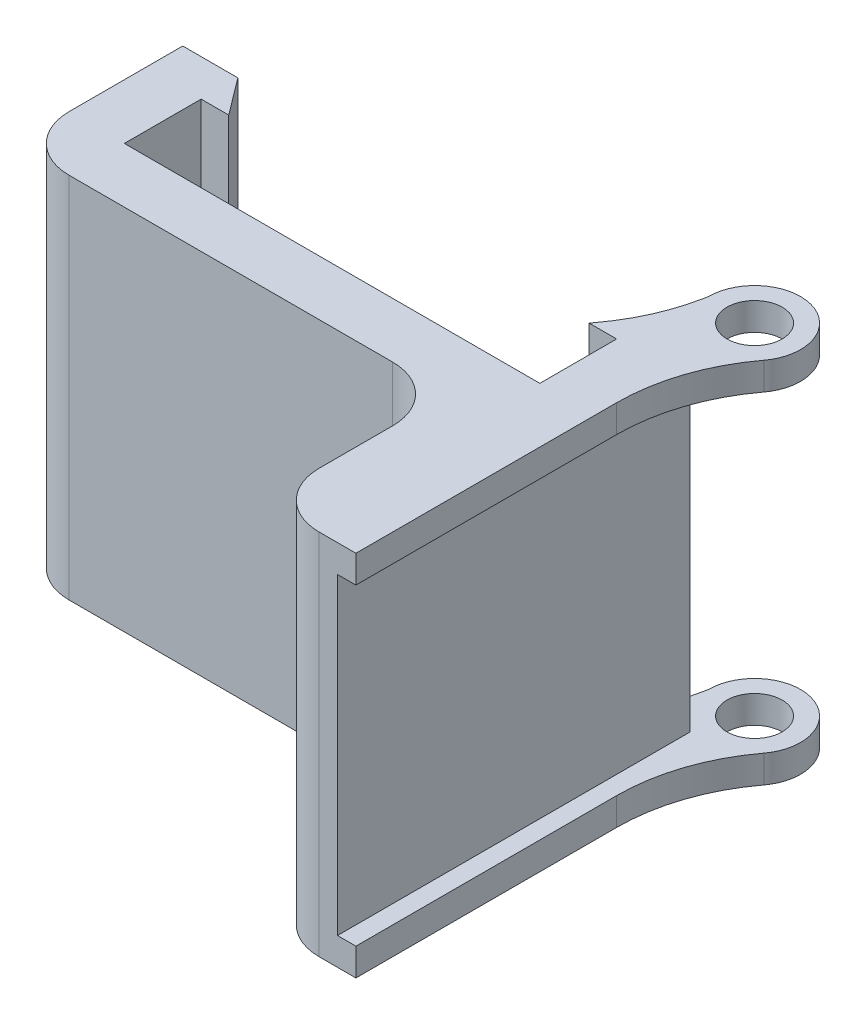
ISO-10303-21;
HEADER;
FILE_DESCRIPTION(('STEP AP214'),'2;1');
FILE_NAME('part.step','',(''),(''),'','','');
FILE_SCHEMA(('AUTOMOTIVE_DESIGN { 1 0 10303 214 1 1 1 1 }'));
ENDSEC;
DATA;
#1=APPLICATION_CONTEXT('core data for automotive mechanical design processes');
#2=APPLICATION_PROTOCOL_DEFINITION('international standard','automotive_design',2000,#1);
#3=PRODUCT_CONTEXT('',#1,'mechanical');
#4=PRODUCT('Part','Part','',(#3));
#5=PRODUCT_RELATED_PRODUCT_CATEGORY('part','',(#4));
#6=PRODUCT_DEFINITION_FORMATION('','',#4);
#7=PRODUCT_DEFINITION_CONTEXT('part definition',#1,'design');
#8=PRODUCT_DEFINITION('design','',#6,#7);
#9=PRODUCT_DEFINITION_SHAPE('','',#8);
#10=(LENGTH_UNIT() NAMED_UNIT(*) SI_UNIT(.MILLI.,.METRE.));
#11=(NAMED_UNIT(*) PLANE_ANGLE_UNIT() SI_UNIT($,.RADIAN.));
#12=(NAMED_UNIT(*) SI_UNIT($,.STERADIAN.) SOLID_ANGLE_UNIT());
#13=UNCERTAINTY_MEASURE_WITH_UNIT(LENGTH_MEASURE(1.E-05),#10,'distance_accuracy_value','');
#14=(GEOMETRIC_REPRESENTATION_CONTEXT(3) GLOBAL_UNCERTAINTY_ASSIGNED_CONTEXT((#13)) GLOBAL_UNIT_ASSIGNED_CONTEXT((#10,
#11,#12)) REPRESENTATION_CONTEXT('',''));
#15=CARTESIAN_POINT('',(0.,0.,0.));
#16=DIRECTION('',(0.,0.,1.));
#17=DIRECTION('',(1.,0.,0.));
#18=AXIS2_PLACEMENT_3D('',#15,#16,#17);
#19=CARTESIAN_POINT('',(0.,0.,18.));
#20=DIRECTION('',(0.,0.,-1.));
#21=DIRECTION('',(0.,1.,0.));
#22=AXIS2_PLACEMENT_3D('',#19,#20,#21);
#23=PLANE('',#22);
#24=DIRECTION('',(1.,0.,0.));
#25=VECTOR('',#24,1.);
#26=CARTESIAN_POINT('',(11.295,74.1919670440661,18.));
#27=LINE('',#26,#25);
#28=CARTESIAN_POINT('',(11.295,74.1919670440661,18.));
#29=VERTEX_POINT('',#28);
#30=CARTESIAN_POINT('',(13.295,74.1919670440661,18.));
#31=VERTEX_POINT('',#30);
#32=EDGE_CURVE('E290',#29,#31,#27,.T.);
#33=ORIENTED_EDGE('',*,*,#32,.T.);
#34=DIRECTION('',(0.,1.,0.));
#35=VECTOR('',#34,1.);
#36=CARTESIAN_POINT('',(13.295,74.1919670440661,18.));
#37=LINE('',#36,#35);
#38=CARTESIAN_POINT('',(13.295,57.1919670440661,18.));
#39=VERTEX_POINT('',#38);
#40=EDGE_CURVE('E257',#39,#31,#37,.T.);
#41=ORIENTED_EDGE('',*,*,#40,.F.);
#42=DIRECTION('',(-1.,0.,0.));
#43=VECTOR('',#42,1.);
#44=CARTESIAN_POINT('',(11.295,57.1919670440661,18.));
#45=LINE('',#44,#43);
#46=CARTESIAN_POINT('',(11.295,57.1919670440661,18.));
#47=VERTEX_POINT('',#46);
#48=EDGE_CURVE('E253',#39,#47,#45,.T.);
#49=ORIENTED_EDGE('',*,*,#48,.T.);
#50=DIRECTION('',(0.,1.,0.));
#51=VECTOR('',#50,1.);
#52=CARTESIAN_POINT('',(11.295,75.6919670440661,18.));
#53=LINE('',#52,#51);
#54=EDGE_CURVE('E385',#47,#29,#53,.T.);
#55=ORIENTED_EDGE('',*,*,#54,.T.);
#56=EDGE_LOOP('',(#33,#41,#49,#55));
#57=FACE_BOUND('',#56,.T.);
#58=ADVANCED_FACE('F54',(#57),#23,.T.);
#59=CARTESIAN_POINT('',(14.295,55.6919670440661,27.175));
#60=DIRECTION('',(-1.,0.,0.));
#61=DIRECTION('',(0.,0.,1.));
#62=AXIS2_PLACEMENT_3D('',#59,#60,#61);
#63=PLANE('',#62);
#64=DIRECTION('',(0.,0.,1.));
#65=VECTOR('',#64,1.);
#66=CARTESIAN_POINT('',(14.295,74.1919670440661,37.175));
#67=LINE('',#66,#65);
#68=CARTESIAN_POINT('',(14.295,74.1919670440661,23.));
#69=VERTEX_POINT('',#68);
#70=CARTESIAN_POINT('',(14.295,74.1919670440661,37.175));
#71=VERTEX_POINT('',#70);
#72=EDGE_CURVE('E266',#69,#71,#67,.T.);
#73=ORIENTED_EDGE('',*,*,#72,.F.);
#74=DIRECTION('',(0.,1.,0.));
#75=VECTOR('',#74,1.);
#76=CARTESIAN_POINT('',(14.295,55.6919670440661,23.));
#77=LINE('',#76,#75);
#78=CARTESIAN_POINT('',(14.295,75.6919670440661,23.));
#79=VERTEX_POINT('',#78);
#80=EDGE_CURVE('E420',#69,#79,#77,.T.);
#81=ORIENTED_EDGE('',*,*,#80,.T.);
#82=DIRECTION('',(0.,0.,-1.));
#83=VECTOR('',#82,1.);
#84=CARTESIAN_POINT('',(14.295,75.6919670440661,27.175));
#85=LINE('',#84,#83);
#86=CARTESIAN_POINT('',(14.295,75.6919670440661,37.175));
#87=VERTEX_POINT('',#86);
#88=EDGE_CURVE('E402',#87,#79,#85,.T.);
#89=ORIENTED_EDGE('',*,*,#88,.F.);
#90=DIRECTION('',(0.,1.,0.));
#91=VECTOR('',#90,1.);
#92=CARTESIAN_POINT('',(14.295,75.6919670440661,37.175));
#93=LINE('',#92,#91);
#94=EDGE_CURVE('E319',#71,#87,#93,.T.);
#95=ORIENTED_EDGE('',*,*,#94,.F.);
#96=EDGE_LOOP('',(#73,#81,#89,#95));
#97=FACE_BOUND('',#96,.T.);
#98=ADVANCED_FACE('F499',(#97),#63,.F.);
#99=CARTESIAN_POINT('',(0.,0.,27.175));
#100=DIRECTION('',(0.,0.,-1.));
#101=DIRECTION('',(-1.,0.,0.));
#102=AXIS2_PLACEMENT_3D('',#99,#100,#101);
#103=PLANE('',#102);
#104=DIRECTION('',(1.,0.,0.));
#105=VECTOR('',#104,1.);
#106=CARTESIAN_POINT('',(-14.295,55.6919670440661,27.175));
#107=LINE('',#106,#105);
#108=CARTESIAN_POINT('',(-11.295,55.6919670440661,27.175));
#109=VERTEX_POINT('',#108);
#110=CARTESIAN_POINT('',(6.295,55.6919670440661,27.175));
#111=VERTEX_POINT('',#110);
#112=EDGE_CURVE('E391',#109,#111,#107,.T.);
#113=ORIENTED_EDGE('',*,*,#112,.T.);
#114=DIRECTION('',(0.,-1.,0.));
#115=VECTOR('',#114,1.);
#116=CARTESIAN_POINT('',(6.295,75.6919670440661,27.175));
#117=LINE('',#116,#115);
#118=CARTESIAN_POINT('',(6.295,75.6919670440661,27.175));
#119=VERTEX_POINT('',#118);
#120=EDGE_CURVE('E76',#111,#119,#117,.F.);
#121=ORIENTED_EDGE('',*,*,#120,.T.);
#122=DIRECTION('',(-1.,0.,0.));
#123=VECTOR('',#122,1.);
#124=CARTESIAN_POINT('',(-14.295,75.6919670440661,27.175));
#125=LINE('',#124,#123);
#126=CARTESIAN_POINT('',(-11.295,75.6919670440661,27.175));
#127=VERTEX_POINT('',#126);
#128=EDGE_CURVE('E393',#119,#127,#125,.T.);
#129=ORIENTED_EDGE('',*,*,#128,.T.);
#130=DIRECTION('',(0.,-1.,0.));
#131=VECTOR('',#130,1.);
#132=CARTESIAN_POINT('',(-11.295,0.,27.175));
#133=LINE('',#132,#131);
#134=EDGE_CURVE('E469',#127,#109,#133,.T.);
#135=ORIENTED_EDGE('',*,*,#134,.T.);
#136=EDGE_LOOP('',(#113,#121,#129,#135));
#137=FACE_BOUND('',#136,.T.);
#138=ADVANCED_FACE('F481',(#137),#103,.F.);
#139=CARTESIAN_POINT('',(0.,0.,24.175));
#140=DIRECTION('',(0.,0.,-1.));
#141=DIRECTION('',(-1.,0.,0.));
#142=AXIS2_PLACEMENT_3D('',#139,#140,#141);
#143=PLANE('',#142);
#144=DIRECTION('',(1.,0.,0.));
#145=VECTOR('',#144,1.);
#146=CARTESIAN_POINT('',(-14.295,55.6919670440661,24.175));
#147=LINE('',#146,#145);
#148=CARTESIAN_POINT('',(-11.295,55.6919670440661,24.175));
#149=VERTEX_POINT('',#148);
#150=CARTESIAN_POINT('',(11.295,55.6919670440661,24.175));
#151=VERTEX_POINT('',#150);
#152=EDGE_CURVE('E388',#149,#151,#147,.T.);
#153=ORIENTED_EDGE('',*,*,#152,.F.);
#154=DIRECTION('',(0.,-1.,0.));
#155=VECTOR('',#154,1.);
#156=CARTESIAN_POINT('',(-11.295,75.6919670440661,24.175));
#157=LINE('',#156,#155);
#158=CARTESIAN_POINT('',(-11.295,75.6919670440661,24.175));
#159=VERTEX_POINT('',#158);
#160=EDGE_CURVE('E364',#159,#149,#157,.T.);
#161=ORIENTED_EDGE('',*,*,#160,.F.);
#162=DIRECTION('',(-1.,0.,0.));
#163=VECTOR('',#162,1.);
#164=CARTESIAN_POINT('',(-14.295,75.6919670440661,24.175));
#165=LINE('',#164,#163);
#166=CARTESIAN_POINT('',(11.295,75.6919670440661,24.175));
#167=VERTEX_POINT('',#166);
#168=EDGE_CURVE('E394',#167,#159,#165,.T.);
#169=ORIENTED_EDGE('',*,*,#168,.F.);
#170=DIRECTION('',(0.,1.,0.));
#171=VECTOR('',#170,1.);
#172=CARTESIAN_POINT('',(11.295,75.6919670440661,24.175));
#173=LINE('',#172,#171);
#174=EDGE_CURVE('E381',#151,#167,#173,.T.);
#175=ORIENTED_EDGE('',*,*,#174,.F.);
#176=EDGE_LOOP('',(#153,#161,#169,#175));
#177=FACE_BOUND('',#176,.T.);
#178=ADVANCED_FACE('F540',(#177),#143,.T.);
#179=CARTESIAN_POINT('',(-14.295,55.6919670440661,27.175));
#180=DIRECTION('',(1.,0.,0.));
#181=DIRECTION('',(0.,0.,-1.));
#182=AXIS2_PLACEMENT_3D('',#179,#180,#181);
#183=PLANE('',#182);
#184=DIRECTION('',(0.,0.,-1.));
#185=VECTOR('',#184,1.);
#186=CARTESIAN_POINT('',(-14.295,55.6919670440661,27.175));
#187=LINE('',#186,#185);
#188=CARTESIAN_POINT('',(-14.295,55.6919670440661,24.175));
#189=VERTEX_POINT('',#188);
#190=CARTESIAN_POINT('',(-14.295,55.6919670440661,18.));
#191=VERTEX_POINT('',#190);
#192=EDGE_CURVE('E408',#189,#191,#187,.T.);
#193=ORIENTED_EDGE('',*,*,#192,.F.);
#194=DIRECTION('',(0.,-1.,0.));
#195=VECTOR('',#194,1.);
#196=CARTESIAN_POINT('',(-14.295,55.6919670440661,24.175));
#197=LINE('',#196,#195);
#198=CARTESIAN_POINT('',(-14.295,75.6919670440661,24.175));
#199=VERTEX_POINT('',#198);
#200=EDGE_CURVE('E473',#189,#199,#197,.F.);
#201=ORIENTED_EDGE('',*,*,#200,.T.);
#202=DIRECTION('',(0.,0.,-1.));
#203=VECTOR('',#202,1.);
#204=CARTESIAN_POINT('',(-14.295,75.6919670440661,27.175));
#205=LINE('',#204,#203);
#206=CARTESIAN_POINT('',(-14.295,75.6919670440661,18.));
#207=VERTEX_POINT('',#206);
#208=EDGE_CURVE('E396',#199,#207,#205,.T.);
#209=ORIENTED_EDGE('',*,*,#208,.T.);
#210=DIRECTION('',(0.,1.,0.));
#211=VECTOR('',#210,1.);
#212=CARTESIAN_POINT('',(-14.295,75.6919670440661,18.));
#213=LINE('',#212,#211);
#214=EDGE_CURVE('E371',#191,#207,#213,.T.);
#215=ORIENTED_EDGE('',*,*,#214,.F.);
#216=EDGE_LOOP('',(#193,#201,#209,#215));
#217=FACE_BOUND('',#216,.T.);
#218=ADVANCED_FACE('F561',(#217),#183,.F.);
#219=CARTESIAN_POINT('',(-14.295,55.6919670440661,27.175));
#220=DIRECTION('',(0.,1.,0.));
#221=DIRECTION('',(0.,0.,1.));
#222=AXIS2_PLACEMENT_3D('',#219,#220,#221);
#223=PLANE('',#222);
#224=CARTESIAN_POINT('',(14.295,55.6919670440661,15.5));
#225=DIRECTION('',(0.,1.,0.));
#226=DIRECTION('',(0.,0.,1.));
#227=AXIS2_PLACEMENT_3D('',#224,#225,#226);
#228=CIRCLE('',#227,1.5);
#229=CARTESIAN_POINT('',(14.295,55.6919670440661,17.));
#230=VERTEX_POINT('',#229);
#231=EDGE_CURVE('E282',#230,#230,#228,.F.);
#232=ORIENTED_EDGE('',*,*,#231,.F.);
#233=EDGE_LOOP('',(#232));
#234=FACE_BOUND('',#233,.T.);
#235=DIRECTION('',(1.,0.,0.));
#236=VECTOR('',#235,1.);
#237=CARTESIAN_POINT('',(14.295,55.6919670440661,37.175));
#238=LINE('',#237,#236);
#239=CARTESIAN_POINT('',(12.295,55.6919670440661,37.175));
#240=VERTEX_POINT('',#239);
#241=CARTESIAN_POINT('',(14.295,55.6919670440661,37.175));
#242=VERTEX_POINT('',#241);
#243=EDGE_CURVE('E323',#240,#242,#238,.T.);
#244=ORIENTED_EDGE('',*,*,#243,.F.);
#245=CARTESIAN_POINT('',(12.295,55.6919670440661,34.175));
#246=DIRECTION('',(0.,1.,0.));
#247=DIRECTION('',(0.,0.,1.));
#248=AXIS2_PLACEMENT_3D('',#245,#246,#247);
#249=CIRCLE('',#248,3.);
#250=CARTESIAN_POINT('',(9.295,55.6919670440661,34.175));
#251=VERTEX_POINT('',#250);
#252=EDGE_CURVE('E459',#240,#251,#249,.F.);
#253=ORIENTED_EDGE('',*,*,#252,.T.);
#254=DIRECTION('',(0.,0.,-1.));
#255=VECTOR('',#254,1.);
#256=CARTESIAN_POINT('',(9.295,55.6919670440661,37.175));
#257=LINE('',#256,#255);
#258=CARTESIAN_POINT('',(9.295,55.6919670440661,30.175));
#259=VERTEX_POINT('',#258);
#260=EDGE_CURVE('E325',#251,#259,#257,.T.);
#261=ORIENTED_EDGE('',*,*,#260,.T.);
#262=CARTESIAN_POINT('',(6.295,55.6919670440661,30.175));
#263=DIRECTION('',(0.,1.,0.));
#264=DIRECTION('',(0.,0.,1.));
#265=AXIS2_PLACEMENT_3D('',#262,#263,#264);
#266=CIRCLE('',#265,3.);
#267=EDGE_CURVE('E62',#259,#111,#266,.T.);
#268=ORIENTED_EDGE('',*,*,#267,.T.);
#269=ORIENTED_EDGE('',*,*,#112,.F.);
#270=CARTESIAN_POINT('',(-11.295,55.6919670440661,24.175));
#271=DIRECTION('',(0.,1.,0.));
#272=DIRECTION('',(0.,0.,1.));
#273=AXIS2_PLACEMENT_3D('',#270,#271,#272);
#274=CIRCLE('',#273,3.);
#275=EDGE_CURVE('E457',#109,#189,#274,.F.);
#276=ORIENTED_EDGE('',*,*,#275,.T.);
#277=ORIENTED_EDGE('',*,*,#192,.T.);
#278=DIRECTION('',(-1.,0.,0.));
#279=VECTOR('',#278,1.);
#280=CARTESIAN_POINT('',(-14.295,55.6919670440661,18.));
#281=LINE('',#280,#279);
#282=CARTESIAN_POINT('',(-11.295,55.6919670440661,18.));
#283=VERTEX_POINT('',#282);
#284=EDGE_CURVE('E365',#283,#191,#281,.T.);
#285=ORIENTED_EDGE('',*,*,#284,.F.);
#286=DIRECTION('',(0.6,0.,0.8));
#287=VECTOR('',#286,1.);
#288=CARTESIAN_POINT('',(-11.295,55.6919670440661,18.));
#289=LINE('',#288,#287);
#290=CARTESIAN_POINT('',(-9.795,55.6919670440661,20.));
#291=VERTEX_POINT('',#290);
#292=EDGE_CURVE('E331',#283,#291,#289,.T.);
#293=ORIENTED_EDGE('',*,*,#292,.T.);
#294=DIRECTION('',(-1.,0.,0.));
#295=VECTOR('',#294,1.);
#296=CARTESIAN_POINT('',(-9.795,55.6919670440661,20.));
#297=LINE('',#296,#295);
#298=CARTESIAN_POINT('',(-11.295,55.6919670440661,20.));
#299=VERTEX_POINT('',#298);
#300=EDGE_CURVE('E338',#291,#299,#297,.T.);
#301=ORIENTED_EDGE('',*,*,#300,.T.);
#302=DIRECTION('',(0.,0.,1.));
#303=VECTOR('',#302,1.);
#304=CARTESIAN_POINT('',(-11.295,55.6919670440661,-5.22374841615669));
#305=LINE('',#304,#303);
#306=EDGE_CURVE('E362',#299,#149,#305,.T.);
#307=ORIENTED_EDGE('',*,*,#306,.T.);
#308=ORIENTED_EDGE('',*,*,#152,.T.);
#309=DIRECTION('',(0.,0.,1.));
#310=VECTOR('',#309,1.);
#311=CARTESIAN_POINT('',(11.295,55.6919670440661,-5.22374841615669));
#312=LINE('',#311,#310);
#313=CARTESIAN_POINT('',(11.295,55.6919670440661,20.));
#314=VERTEX_POINT('',#313);
#315=EDGE_CURVE('E368',#314,#151,#312,.T.);
#316=ORIENTED_EDGE('',*,*,#315,.F.);
#317=DIRECTION('',(-1.,0.,0.));
#318=VECTOR('',#317,1.);
#319=CARTESIAN_POINT('',(11.295,55.6919670440661,20.));
#320=LINE('',#319,#318);
#321=CARTESIAN_POINT('',(9.795,55.6919670440661,20.));
#322=VERTEX_POINT('',#321);
#323=EDGE_CURVE('E350',#314,#322,#320,.T.);
#324=ORIENTED_EDGE('',*,*,#323,.T.);
#325=DIRECTION('',(0.6,0.,-0.8));
#326=VECTOR('',#325,1.);
#327=CARTESIAN_POINT('',(9.795,55.6919670440661,20.));
#328=LINE('',#327,#326);
#329=CARTESIAN_POINT('',(9.9340376902015,55.6919670440661,19.8146164130647));
#330=VERTEX_POINT('',#329);
#331=EDGE_CURVE('E347',#322,#330,#328,.T.);
#332=ORIENTED_EDGE('',*,*,#331,.T.);
#333=CARTESIAN_POINT('',(1.9340376902015,55.6919670440661,13.8146164130647));
#334=DIRECTION('',(0.,1.,0.));
#335=DIRECTION('',(0.,0.,1.));
#336=AXIS2_PLACEMENT_3D('',#333,#334,#335);
#337=CIRCLE('',#336,10.);
#338=CARTESIAN_POINT('',(11.7398444471107,55.6919670440661,15.7757777644465));
#339=VERTEX_POINT('',#338);
#340=EDGE_CURVE('E448',#330,#339,#337,.T.);
#341=ORIENTED_EDGE('',*,*,#340,.T.);
#342=DIRECTION('',(0.196116135138184,0.,-0.98058067569092));
#343=VECTOR('',#342,1.);
#344=CARTESIAN_POINT('',(11.295,55.6919670440661,18.));
#345=LINE('',#344,#343);
#346=CARTESIAN_POINT('',(11.795,55.6919670440661,15.5));
#347=VERTEX_POINT('',#346);
#348=EDGE_CURVE('E305',#339,#347,#345,.T.);
#349=ORIENTED_EDGE('',*,*,#348,.T.);
#350=CARTESIAN_POINT('',(14.295,55.6919670440661,15.5));
#351=DIRECTION('',(0.,-1.,0.));
#352=DIRECTION('',(0.,0.,-1.));
#353=AXIS2_PLACEMENT_3D('',#350,#351,#352);
#354=CIRCLE('',#353,2.5);
#355=CARTESIAN_POINT('',(16.295,55.6919670440661,17.));
#356=VERTEX_POINT('',#355);
#357=EDGE_CURVE('E308',#347,#356,#354,.T.);
#358=ORIENTED_EDGE('',*,*,#357,.T.);
#359=CARTESIAN_POINT('',(24.295,55.6919670440661,23.));
#360=DIRECTION('',(0.,1.,0.));
#361=DIRECTION('',(0.,0.,1.));
#362=AXIS2_PLACEMENT_3D('',#359,#360,#361);
#363=CIRCLE('',#362,10.);
#364=CARTESIAN_POINT('',(14.295,55.6919670440661,23.));
#365=VERTEX_POINT('',#364);
#366=EDGE_CURVE('E422',#356,#365,#363,.T.);
#367=ORIENTED_EDGE('',*,*,#366,.T.);
#368=DIRECTION('',(0.,0.,-1.));
#369=VECTOR('',#368,1.);
#370=CARTESIAN_POINT('',(14.295,55.6919670440661,27.175));
#371=LINE('',#370,#369);
#372=EDGE_CURVE('E405',#242,#365,#371,.T.);
#373=ORIENTED_EDGE('',*,*,#372,.F.);
#374=EDGE_LOOP('',(#244,#253,#261,#268,#269,#276,#277,#285,#293,#301,#307,#308,#316,#324,#332,
#341,#349,#358,#367,#373));
#375=FACE_BOUND('',#374,.T.);
#376=ADVANCED_FACE('F477',(#234,#375),#223,.F.);
#377=ORIENTED_EDGE('',*,*,#372,.T.);
#378=DIRECTION('',(0.,-1.,0.));
#379=VECTOR('',#378,1.);
#380=CARTESIAN_POINT('',(14.295,55.6919670440661,23.));
#381=LINE('',#380,#379);
#382=CARTESIAN_POINT('',(14.295,57.1919670440661,23.));
#383=VERTEX_POINT('',#382);
#384=EDGE_CURVE('E415',#365,#383,#381,.F.);
#385=ORIENTED_EDGE('',*,*,#384,.T.);
#386=DIRECTION('',(0.,0.,-1.));
#387=VECTOR('',#386,1.);
#388=CARTESIAN_POINT('',(14.295,57.1919670440661,37.175));
#389=LINE('',#388,#387);
#390=CARTESIAN_POINT('',(14.295,57.1919670440661,37.175));
#391=VERTEX_POINT('',#390);
#392=EDGE_CURVE('E586',#391,#383,#389,.T.);
#393=ORIENTED_EDGE('',*,*,#392,.F.);
#394=EDGE_CURVE('E272',#242,#391,#93,.T.);
#395=ORIENTED_EDGE('',*,*,#394,.F.);
#396=EDGE_LOOP('',(#377,#385,#393,#395));
#397=FACE_BOUND('',#396,.T.);
#398=ADVANCED_FACE('F585',(#397),#63,.F.);
#399=CARTESIAN_POINT('',(-14.295,75.6919670440661,27.175));
#400=DIRECTION('',(0.,-1.,0.));
#401=DIRECTION('',(0.,0.,-1.));
#402=AXIS2_PLACEMENT_3D('',#399,#400,#401);
#403=PLANE('',#402);
#404=CARTESIAN_POINT('',(14.295,75.6919670440661,15.5));
#405=DIRECTION('',(0.,1.,0.));
#406=DIRECTION('',(0.,0.,1.));
#407=AXIS2_PLACEMENT_3D('',#404,#405,#406);
#408=CIRCLE('',#407,1.5);
#409=CARTESIAN_POINT('',(14.295,75.6919670440661,17.));
#410=VERTEX_POINT('',#409);
#411=EDGE_CURVE('E275',#410,#410,#408,.T.);
#412=ORIENTED_EDGE('',*,*,#411,.F.);
#413=EDGE_LOOP('',(#412));
#414=FACE_BOUND('',#413,.T.);
#415=DIRECTION('',(0.,0.,-1.));
#416=VECTOR('',#415,1.);
#417=CARTESIAN_POINT('',(9.295,75.6919670440661,37.175));
#418=LINE('',#417,#416);
#419=CARTESIAN_POINT('',(9.295,75.6919670440661,34.175));
#420=VERTEX_POINT('',#419);
#421=CARTESIAN_POINT('',(9.295,75.6919670440661,30.175));
#422=VERTEX_POINT('',#421);
#423=EDGE_CURVE('E328',#420,#422,#418,.T.);
#424=ORIENTED_EDGE('',*,*,#423,.F.);
#425=CARTESIAN_POINT('',(12.295,75.6919670440661,34.175));
#426=DIRECTION('',(0.,-1.,0.));
#427=DIRECTION('',(0.,0.,-1.));
#428=AXIS2_PLACEMENT_3D('',#425,#426,#427);
#429=CIRCLE('',#428,3.);
#430=CARTESIAN_POINT('',(12.295,75.6919670440661,37.175));
#431=VERTEX_POINT('',#430);
#432=EDGE_CURVE('E467',#420,#431,#429,.F.);
#433=ORIENTED_EDGE('',*,*,#432,.T.);
#434=DIRECTION('',(-1.,0.,0.));
#435=VECTOR('',#434,1.);
#436=CARTESIAN_POINT('',(14.295,75.6919670440661,37.175));
#437=LINE('',#436,#435);
#438=EDGE_CURVE('E321',#87,#431,#437,.T.);
#439=ORIENTED_EDGE('',*,*,#438,.F.);
#440=ORIENTED_EDGE('',*,*,#88,.T.);
#441=CARTESIAN_POINT('',(24.295,75.6919670440661,23.));
#442=DIRECTION('',(0.,-1.,0.));
#443=DIRECTION('',(0.,0.,-1.));
#444=AXIS2_PLACEMENT_3D('',#441,#442,#443);
#445=CIRCLE('',#444,10.);
#446=CARTESIAN_POINT('',(16.295,75.6919670440661,17.));
#447=VERTEX_POINT('',#446);
#448=EDGE_CURVE('E428',#79,#447,#445,.T.);
#449=ORIENTED_EDGE('',*,*,#448,.T.);
#450=CARTESIAN_POINT('',(14.295,75.6919670440661,15.5));
#451=DIRECTION('',(0.,1.,0.));
#452=DIRECTION('',(0.,0.,1.));
#453=AXIS2_PLACEMENT_3D('',#450,#451,#452);
#454=CIRCLE('',#453,2.5);
#455=CARTESIAN_POINT('',(11.795,75.6919670440661,15.5));
#456=VERTEX_POINT('',#455);
#457=EDGE_CURVE('E289',#447,#456,#454,.T.);
#458=ORIENTED_EDGE('',*,*,#457,.T.);
#459=DIRECTION('',(-0.196116135138184,0.,0.98058067569092));
#460=VECTOR('',#459,1.);
#461=CARTESIAN_POINT('',(11.295,75.6919670440661,18.));
#462=LINE('',#461,#460);
#463=CARTESIAN_POINT('',(11.7398444471107,75.6919670440661,15.7757777644465));
#464=VERTEX_POINT('',#463);
#465=EDGE_CURVE('E294',#456,#464,#462,.T.);
#466=ORIENTED_EDGE('',*,*,#465,.T.);
#467=CARTESIAN_POINT('',(1.9340376902015,75.6919670440661,13.8146164130647));
#468=DIRECTION('',(0.,-1.,0.));
#469=DIRECTION('',(0.,0.,-1.));
#470=AXIS2_PLACEMENT_3D('',#467,#468,#469);
#471=CIRCLE('',#470,10.);
#472=CARTESIAN_POINT('',(9.9340376902015,75.6919670440661,19.8146164130647));
#473=VERTEX_POINT('',#472);
#474=EDGE_CURVE('E450',#464,#473,#471,.T.);
#475=ORIENTED_EDGE('',*,*,#474,.T.);
#476=DIRECTION('',(-0.6,0.,0.8));
#477=VECTOR('',#476,1.);
#478=CARTESIAN_POINT('',(9.795,75.6919670440661,20.));
#479=LINE('',#478,#477);
#480=CARTESIAN_POINT('',(9.795,75.6919670440661,20.));
#481=VERTEX_POINT('',#480);
#482=EDGE_CURVE('E344',#473,#481,#479,.T.);
#483=ORIENTED_EDGE('',*,*,#482,.T.);
#484=DIRECTION('',(1.,0.,0.));
#485=VECTOR('',#484,1.);
#486=CARTESIAN_POINT('',(11.295,75.6919670440661,20.));
#487=LINE('',#486,#485);
#488=CARTESIAN_POINT('',(11.295,75.6919670440661,20.));
#489=VERTEX_POINT('',#488);
#490=EDGE_CURVE('E353',#481,#489,#487,.T.);
#491=ORIENTED_EDGE('',*,*,#490,.T.);
#492=DIRECTION('',(0.,0.,1.));
#493=VECTOR('',#492,1.);
#494=CARTESIAN_POINT('',(11.295,75.6919670440661,-5.22374841615669));
#495=LINE('',#494,#493);
#496=EDGE_CURVE('E384',#489,#167,#495,.T.);
#497=ORIENTED_EDGE('',*,*,#496,.T.);
#498=ORIENTED_EDGE('',*,*,#168,.T.);
#499=DIRECTION('',(0.,0.,1.));
#500=VECTOR('',#499,1.);
#501=CARTESIAN_POINT('',(-11.295,75.6919670440661,-5.22374841615669));
#502=LINE('',#501,#500);
#503=CARTESIAN_POINT('',(-11.295,75.6919670440661,20.));
#504=VERTEX_POINT('',#503);
#505=EDGE_CURVE('E366',#504,#159,#502,.T.);
#506=ORIENTED_EDGE('',*,*,#505,.F.);
#507=DIRECTION('',(1.,0.,0.));
#508=VECTOR('',#507,1.);
#509=CARTESIAN_POINT('',(-9.795,75.6919670440661,20.));
#510=LINE('',#509,#508);
#511=CARTESIAN_POINT('',(-9.795,75.6919670440661,20.));
#512=VERTEX_POINT('',#511);
#513=EDGE_CURVE('E335',#504,#512,#510,.T.);
#514=ORIENTED_EDGE('',*,*,#513,.T.);
#515=DIRECTION('',(-0.6,0.,-0.8));
#516=VECTOR('',#515,1.);
#517=CARTESIAN_POINT('',(-11.295,75.6919670440661,18.));
#518=LINE('',#517,#516);
#519=CARTESIAN_POINT('',(-11.295,75.6919670440661,18.));
#520=VERTEX_POINT('',#519);
#521=EDGE_CURVE('E341',#512,#520,#518,.T.);
#522=ORIENTED_EDGE('',*,*,#521,.T.);
#523=DIRECTION('',(1.,0.,0.));
#524=VECTOR('',#523,1.);
#525=CARTESIAN_POINT('',(-14.295,75.6919670440661,18.));
#526=LINE('',#525,#524);
#527=EDGE_CURVE('E374',#207,#520,#526,.T.);
#528=ORIENTED_EDGE('',*,*,#527,.F.);
#529=ORIENTED_EDGE('',*,*,#208,.F.);
#530=CARTESIAN_POINT('',(-11.295,75.6919670440661,24.175));
#531=DIRECTION('',(0.,-1.,0.));
#532=DIRECTION('',(0.,0.,-1.));
#533=AXIS2_PLACEMENT_3D('',#530,#531,#532);
#534=CIRCLE('',#533,3.);
#535=EDGE_CURVE('E69',#199,#127,#534,.F.);
#536=ORIENTED_EDGE('',*,*,#535,.T.);
#537=ORIENTED_EDGE('',*,*,#128,.F.);
#538=CARTESIAN_POINT('',(6.295,75.6919670440661,30.175));
#539=DIRECTION('',(0.,-1.,0.));
#540=DIRECTION('',(0.,0.,-1.));
#541=AXIS2_PLACEMENT_3D('',#538,#539,#540);
#542=CIRCLE('',#541,3.);
#543=EDGE_CURVE('E12',#119,#422,#542,.T.);
#544=ORIENTED_EDGE('',*,*,#543,.T.);
#545=EDGE_LOOP('',(#424,#433,#439,#440,#449,#458,#466,#475,#483,#491,#497,#498,#506,#514,#522,
#528,#529,#536,#537,#544));
#546=FACE_BOUND('',#545,.T.);
#547=ADVANCED_FACE('F486',(#414,#546),#403,.F.);
#548=CARTESIAN_POINT('',(11.295,75.6919670440661,-5.22374841615669));
#549=DIRECTION('',(1.,0.,0.));
#550=DIRECTION('',(0.,1.,0.));
#551=AXIS2_PLACEMENT_3D('',#548,#549,#550);
#552=PLANE('',#551);
#553=ORIENTED_EDGE('',*,*,#496,.F.);
#554=DIRECTION('',(0.,1.,0.));
#555=VECTOR('',#554,1.);
#556=CARTESIAN_POINT('',(11.295,53.1919670440661,20.));
#557=LINE('',#556,#555);
#558=EDGE_CURVE('E351',#314,#489,#557,.T.);
#559=ORIENTED_EDGE('',*,*,#558,.F.);
#560=ORIENTED_EDGE('',*,*,#315,.T.);
#561=ORIENTED_EDGE('',*,*,#174,.T.);
#562=EDGE_LOOP('',(#553,#559,#560,#561));
#563=FACE_BOUND('',#562,.T.);
#564=ADVANCED_FACE('F535',(#563),#552,.F.);
#565=CARTESIAN_POINT('',(-11.295,75.6919670440661,-5.22374841615669));
#566=DIRECTION('',(-1.,0.,0.));
#567=DIRECTION('',(0.,-1.,0.));
#568=AXIS2_PLACEMENT_3D('',#565,#566,#567);
#569=PLANE('',#568);
#570=ORIENTED_EDGE('',*,*,#306,.F.);
#571=DIRECTION('',(0.,1.,0.));
#572=VECTOR('',#571,1.);
#573=CARTESIAN_POINT('',(-11.295,53.1919670440661,20.));
#574=LINE('',#573,#572);
#575=EDGE_CURVE('E332',#299,#504,#574,.T.);
#576=ORIENTED_EDGE('',*,*,#575,.T.);
#577=ORIENTED_EDGE('',*,*,#505,.T.);
#578=ORIENTED_EDGE('',*,*,#160,.T.);
#579=EDGE_LOOP('',(#570,#576,#577,#578));
#580=FACE_BOUND('',#579,.T.);
#581=ADVANCED_FACE('F545',(#580),#569,.F.);
#582=CARTESIAN_POINT('',(0.,0.,18.));
#583=DIRECTION('',(0.,0.,-1.));
#584=DIRECTION('',(0.,1.,0.));
#585=AXIS2_PLACEMENT_3D('',#582,#583,#584);
#586=PLANE('',#585);
#587=ORIENTED_EDGE('',*,*,#284,.T.);
#588=ORIENTED_EDGE('',*,*,#214,.T.);
#589=ORIENTED_EDGE('',*,*,#527,.T.);
#590=DIRECTION('',(0.,-1.,0.));
#591=VECTOR('',#590,1.);
#592=CARTESIAN_POINT('',(-11.295,75.6919670440661,18.));
#593=LINE('',#592,#591);
#594=EDGE_CURVE('E361',#520,#283,#593,.T.);
#595=ORIENTED_EDGE('',*,*,#594,.T.);
#596=EDGE_LOOP('',(#587,#588,#589,#595));
#597=FACE_BOUND('',#596,.T.);
#598=ADVANCED_FACE('F556',(#597),#586,.T.);
#599=CARTESIAN_POINT('',(9.795,53.1919670440661,20.));
#600=DIRECTION('',(-0.8,0.,-0.6));
#601=DIRECTION('',(-0.6,0.,0.8));
#602=AXIS2_PLACEMENT_3D('',#599,#600,#601);
#603=PLANE('',#602);
#604=ORIENTED_EDGE('',*,*,#54,.F.);
#605=DIRECTION('',(-0.6,0.,0.8));
#606=VECTOR('',#605,1.);
#607=CARTESIAN_POINT('',(9.795,57.1919670440661,20.));
#608=LINE('',#607,#606);
#609=CARTESIAN_POINT('',(9.9340376902015,57.1919670440661,19.8146164130647));
#610=VERTEX_POINT('',#609);
#611=EDGE_CURVE('E440',#47,#610,#608,.T.);
#612=ORIENTED_EDGE('',*,*,#611,.T.);
#613=DIRECTION('',(0.,1.,0.));
#614=VECTOR('',#613,1.);
#615=CARTESIAN_POINT('',(9.9340376902015,55.6919670440661,19.8146164130647));
#616=LINE('',#615,#614);
#617=EDGE_CURVE('E438',#610,#330,#616,.F.);
#618=ORIENTED_EDGE('',*,*,#617,.T.);
#619=ORIENTED_EDGE('',*,*,#331,.F.);
#620=DIRECTION('',(0.,1.,0.));
#621=VECTOR('',#620,1.);
#622=CARTESIAN_POINT('',(9.795,53.1919670440661,20.));
#623=LINE('',#622,#621);
#624=EDGE_CURVE('E356',#322,#481,#623,.T.);
#625=ORIENTED_EDGE('',*,*,#624,.T.);
#626=ORIENTED_EDGE('',*,*,#482,.F.);
#627=DIRECTION('',(0.,1.,0.));
#628=VECTOR('',#627,1.);
#629=CARTESIAN_POINT('',(9.9340376902015,74.1919670440661,19.8146164130647));
#630=LINE('',#629,#628);
#631=CARTESIAN_POINT('',(9.9340376902015,74.1919670440661,19.8146164130647));
#632=VERTEX_POINT('',#631);
#633=EDGE_CURVE('E435',#473,#632,#630,.F.);
#634=ORIENTED_EDGE('',*,*,#633,.T.);
#635=DIRECTION('',(0.6,0.,-0.8));
#636=VECTOR('',#635,1.);
#637=CARTESIAN_POINT('',(9.795,74.1919670440661,20.));
#638=LINE('',#637,#636);
#639=EDGE_CURVE('E433',#632,#29,#638,.T.);
#640=ORIENTED_EDGE('',*,*,#639,.T.);
#641=EDGE_LOOP('',(#604,#612,#618,#619,#625,#626,#634,#640));
#642=FACE_BOUND('',#641,.T.);
#643=ADVANCED_FACE('F525',(#642),#603,.T.);
#644=CARTESIAN_POINT('',(11.295,53.1919670440661,20.));
#645=DIRECTION('',(0.,0.,1.));
#646=DIRECTION('',(1.,0.,0.));
#647=AXIS2_PLACEMENT_3D('',#644,#645,#646);
#648=PLANE('',#647);
#649=ORIENTED_EDGE('',*,*,#323,.F.);
#650=ORIENTED_EDGE('',*,*,#558,.T.);
#651=ORIENTED_EDGE('',*,*,#490,.F.);
#652=ORIENTED_EDGE('',*,*,#624,.F.);
#653=EDGE_LOOP('',(#649,#650,#651,#652));
#654=FACE_BOUND('',#653,.T.);
#655=ADVANCED_FACE('F530',(#654),#648,.T.);
#656=CARTESIAN_POINT('',(-11.295,53.1919670440661,18.));
#657=DIRECTION('',(0.8,0.,-0.6));
#658=DIRECTION('',(-0.6,0.,-0.8));
#659=AXIS2_PLACEMENT_3D('',#656,#657,#658);
#660=PLANE('',#659);
#661=ORIENTED_EDGE('',*,*,#292,.F.);
#662=ORIENTED_EDGE('',*,*,#594,.F.);
#663=ORIENTED_EDGE('',*,*,#521,.F.);
#664=DIRECTION('',(0.,1.,0.));
#665=VECTOR('',#664,1.);
#666=CARTESIAN_POINT('',(-9.795,53.1919670440661,20.));
#667=LINE('',#666,#665);
#668=EDGE_CURVE('E336',#291,#512,#667,.T.);
#669=ORIENTED_EDGE('',*,*,#668,.F.);
#670=EDGE_LOOP('',(#661,#662,#663,#669));
#671=FACE_BOUND('',#670,.T.);
#672=ADVANCED_FACE('F553',(#671),#660,.T.);
#673=CARTESIAN_POINT('',(-9.795,53.1919670440661,20.));
#674=DIRECTION('',(0.,0.,1.));
#675=DIRECTION('',(1.,0.,0.));
#676=AXIS2_PLACEMENT_3D('',#673,#674,#675);
#677=PLANE('',#676);
#678=ORIENTED_EDGE('',*,*,#300,.F.);
#679=ORIENTED_EDGE('',*,*,#668,.T.);
#680=ORIENTED_EDGE('',*,*,#513,.F.);
#681=ORIENTED_EDGE('',*,*,#575,.F.);
#682=EDGE_LOOP('',(#678,#679,#680,#681));
#683=FACE_BOUND('',#682,.T.);
#684=ADVANCED_FACE('F549',(#683),#677,.T.);
#685=CARTESIAN_POINT('',(9.295,75.6919670440661,37.175));
#686=DIRECTION('',(1.,0.,0.));
#687=DIRECTION('',(0.,1.,0.));
#688=AXIS2_PLACEMENT_3D('',#685,#686,#687);
#689=PLANE('',#688);
#690=ORIENTED_EDGE('',*,*,#260,.F.);
#691=DIRECTION('',(0.,-1.,0.));
#692=VECTOR('',#691,1.);
#693=CARTESIAN_POINT('',(9.295,75.6919670440661,34.175));
#694=LINE('',#693,#692);
#695=EDGE_CURVE('E464',#251,#420,#694,.F.);
#696=ORIENTED_EDGE('',*,*,#695,.T.);
#697=ORIENTED_EDGE('',*,*,#423,.T.);
#698=DIRECTION('',(0.,-1.,0.));
#699=VECTOR('',#698,1.);
#700=CARTESIAN_POINT('',(9.295,55.6919670440661,30.175));
#701=LINE('',#700,#699);
#702=EDGE_CURVE('E461',#422,#259,#701,.T.);
#703=ORIENTED_EDGE('',*,*,#702,.T.);
#704=EDGE_LOOP('',(#690,#696,#697,#703));
#705=FACE_BOUND('',#704,.T.);
#706=ADVANCED_FACE('F489',(#705),#689,.F.);
#707=CARTESIAN_POINT('',(0.,0.,37.175));
#708=DIRECTION('',(0.,0.,-1.));
#709=DIRECTION('',(-1.,0.,0.));
#710=AXIS2_PLACEMENT_3D('',#707,#708,#709);
#711=PLANE('',#710);
#712=ORIENTED_EDGE('',*,*,#438,.T.);
#713=DIRECTION('',(0.,-1.,0.));
#714=VECTOR('',#713,1.);
#715=CARTESIAN_POINT('',(12.295,0.,37.175));
#716=LINE('',#715,#714);
#717=EDGE_CURVE('E454',#431,#240,#716,.T.);
#718=ORIENTED_EDGE('',*,*,#717,.T.);
#719=ORIENTED_EDGE('',*,*,#243,.T.);
#720=ORIENTED_EDGE('',*,*,#394,.T.);
#721=DIRECTION('',(1.,0.,0.));
#722=VECTOR('',#721,1.);
#723=CARTESIAN_POINT('',(13.295,57.1919670440661,37.175));
#724=LINE('',#723,#722);
#725=CARTESIAN_POINT('',(13.295,57.1919670440661,37.175));
#726=VERTEX_POINT('',#725);
#727=EDGE_CURVE('E250',#726,#391,#724,.T.);
#728=ORIENTED_EDGE('',*,*,#727,.F.);
#729=DIRECTION('',(0.,-1.,0.));
#730=VECTOR('',#729,1.);
#731=CARTESIAN_POINT('',(13.295,74.1919670440661,37.175));
#732=LINE('',#731,#730);
#733=CARTESIAN_POINT('',(13.295,74.1919670440661,37.175));
#734=VERTEX_POINT('',#733);
#735=EDGE_CURVE('E258',#734,#726,#732,.T.);
#736=ORIENTED_EDGE('',*,*,#735,.F.);
#737=DIRECTION('',(1.,0.,0.));
#738=VECTOR('',#737,1.);
#739=CARTESIAN_POINT('',(13.295,74.1919670440661,37.175));
#740=LINE('',#739,#738);
#741=EDGE_CURVE('E273',#734,#71,#740,.T.);
#742=ORIENTED_EDGE('',*,*,#741,.T.);
#743=ORIENTED_EDGE('',*,*,#94,.T.);
#744=EDGE_LOOP('',(#712,#718,#719,#720,#728,#736,#742,#743));
#745=FACE_BOUND('',#744,.T.);
#746=ADVANCED_FACE('F270',(#745),#711,.F.);
#747=CARTESIAN_POINT('',(14.295,57.1919670440661,15.5));
#748=DIRECTION('',(0.,-1.,0.));
#749=DIRECTION('',(0.,0.,-1.));
#750=AXIS2_PLACEMENT_3D('',#747,#748,#749);
#751=CYLINDRICAL_SURFACE('',#750,2.5);
#752=CARTESIAN_POINT('',(14.295,57.1919670440661,15.5));
#753=DIRECTION('',(0.,-1.,0.));
#754=DIRECTION('',(0.,0.,-1.));
#755=AXIS2_PLACEMENT_3D('',#752,#753,#754);
#756=CIRCLE('',#755,2.5);
#757=CARTESIAN_POINT('',(11.795,57.1919670440661,15.5));
#758=VERTEX_POINT('',#757);
#759=CARTESIAN_POINT('',(16.295,57.1919670440661,17.));
#760=VERTEX_POINT('',#759);
#761=EDGE_CURVE('E310',#758,#760,#756,.T.);
#762=ORIENTED_EDGE('',*,*,#761,.T.);
#763=DIRECTION('',(0.,-1.,0.));
#764=VECTOR('',#763,1.);
#765=CARTESIAN_POINT('',(16.295,57.1919670440661,17.));
#766=LINE('',#765,#764);
#767=EDGE_CURVE('E410',#760,#356,#766,.T.);
#768=ORIENTED_EDGE('',*,*,#767,.T.);
#769=ORIENTED_EDGE('',*,*,#357,.F.);
#770=DIRECTION('',(0.,-1.,0.));
#771=VECTOR('',#770,1.);
#772=CARTESIAN_POINT('',(11.795,57.1919670440661,15.5));
#773=LINE('',#772,#771);
#774=EDGE_CURVE('E313',#758,#347,#773,.T.);
#775=ORIENTED_EDGE('',*,*,#774,.F.);
#776=EDGE_LOOP('',(#762,#768,#769,#775));
#777=FACE_BOUND('',#776,.T.);
#778=ADVANCED_FACE('F578',(#777),#751,.T.);
#779=CARTESIAN_POINT('',(11.295,57.1919670440661,18.));
#780=DIRECTION('',(-0.98058067569092,0.,-0.196116135138184));
#781=DIRECTION('',(-0.196116135138184,0.,0.98058067569092));
#782=AXIS2_PLACEMENT_3D('',#779,#780,#781);
#783=PLANE('',#782);
#784=ORIENTED_EDGE('',*,*,#348,.F.);
#785=DIRECTION('',(0.,1.,0.));
#786=VECTOR('',#785,1.);
#787=CARTESIAN_POINT('',(11.7398444471107,57.1919670440661,15.7757777644465));
#788=LINE('',#787,#786);
#789=CARTESIAN_POINT('',(11.7398444471107,57.1919670440661,15.7757777644465));
#790=VERTEX_POINT('',#789);
#791=EDGE_CURVE('E430',#339,#790,#788,.T.);
#792=ORIENTED_EDGE('',*,*,#791,.T.);
#793=DIRECTION('',(0.196116135138184,0.,-0.98058067569092));
#794=VECTOR('',#793,1.);
#795=CARTESIAN_POINT('',(11.295,57.1919670440661,18.));
#796=LINE('',#795,#794);
#797=EDGE_CURVE('E307',#790,#758,#796,.T.);
#798=ORIENTED_EDGE('',*,*,#797,.T.);
#799=ORIENTED_EDGE('',*,*,#774,.T.);
#800=EDGE_LOOP('',(#784,#792,#798,#799));
#801=FACE_BOUND('',#800,.T.);
#802=ADVANCED_FACE('F572',(#801),#783,.T.);
#803=CARTESIAN_POINT('',(14.295,57.1919670440661,15.5));
#804=DIRECTION('',(0.,-1.,0.));
#805=DIRECTION('',(0.,0.,-1.));
#806=AXIS2_PLACEMENT_3D('',#803,#804,#805);
#807=PLANE('',#806);
#808=CARTESIAN_POINT('',(14.295,57.1919670440661,15.5));
#809=DIRECTION('',(0.,-1.,0.));
#810=DIRECTION('',(0.,0.,-1.));
#811=AXIS2_PLACEMENT_3D('',#808,#809,#810);
#812=CIRCLE('',#811,1.5);
#813=CARTESIAN_POINT('',(14.295,57.1919670440661,14.));
#814=VERTEX_POINT('',#813);
#815=EDGE_CURVE('E286',#814,#814,#812,.T.);
#816=ORIENTED_EDGE('',*,*,#815,.T.);
#817=EDGE_LOOP('',(#816));
#818=FACE_BOUND('',#817,.T.);
#819=ORIENTED_EDGE('',*,*,#48,.F.);
#820=DIRECTION('',(0.,0.,-1.));
#821=VECTOR('',#820,1.);
#822=CARTESIAN_POINT('',(13.295,57.1919670440661,37.175));
#823=LINE('',#822,#821);
#824=EDGE_CURVE('E245',#726,#39,#823,.T.);
#825=ORIENTED_EDGE('',*,*,#824,.F.);
#826=ORIENTED_EDGE('',*,*,#727,.T.);
#827=ORIENTED_EDGE('',*,*,#392,.T.);
#828=CARTESIAN_POINT('',(24.295,57.1919670440661,23.));
#829=DIRECTION('',(0.,-1.,0.));
#830=DIRECTION('',(0.,0.,-1.));
#831=AXIS2_PLACEMENT_3D('',#828,#829,#830);
#832=CIRCLE('',#831,10.);
#833=EDGE_CURVE('E424',#383,#760,#832,.T.);
#834=ORIENTED_EDGE('',*,*,#833,.T.);
#835=ORIENTED_EDGE('',*,*,#761,.F.);
#836=ORIENTED_EDGE('',*,*,#797,.F.);
#837=CARTESIAN_POINT('',(1.9340376902015,57.1919670440661,13.8146164130647));
#838=DIRECTION('',(0.,-1.,0.));
#839=DIRECTION('',(0.,0.,-1.));
#840=AXIS2_PLACEMENT_3D('',#837,#838,#839);
#841=CIRCLE('',#840,10.);
#842=EDGE_CURVE('E446',#790,#610,#841,.T.);
#843=ORIENTED_EDGE('',*,*,#842,.T.);
#844=ORIENTED_EDGE('',*,*,#611,.F.);
#845=EDGE_LOOP('',(#819,#825,#826,#827,#834,#835,#836,#843,#844));
#846=FACE_BOUND('',#845,.T.);
#847=ADVANCED_FACE('F247',(#818,#846),#807,.F.);
#848=CARTESIAN_POINT('',(11.295,74.1919670440661,18.));
#849=DIRECTION('',(-0.98058067569092,0.,-0.196116135138184));
#850=DIRECTION('',(-0.196116135138184,0.,0.98058067569092));
#851=AXIS2_PLACEMENT_3D('',#848,#849,#850);
#852=PLANE('',#851);
#853=DIRECTION('',(-0.196116135138184,0.,0.98058067569092));
#854=VECTOR('',#853,1.);
#855=CARTESIAN_POINT('',(11.295,74.1919670440661,18.));
#856=LINE('',#855,#854);
#857=CARTESIAN_POINT('',(11.795,74.1919670440661,15.5));
#858=VERTEX_POINT('',#857);
#859=CARTESIAN_POINT('',(11.7398444471107,74.1919670440661,15.7757777644465));
#860=VERTEX_POINT('',#859);
#861=EDGE_CURVE('E296',#858,#860,#856,.T.);
#862=ORIENTED_EDGE('',*,*,#861,.T.);
#863=DIRECTION('',(0.,1.,0.));
#864=VECTOR('',#863,1.);
#865=CARTESIAN_POINT('',(11.7398444471107,75.6919670440661,15.7757777644465));
#866=LINE('',#865,#864);
#867=EDGE_CURVE('E443',#860,#464,#866,.T.);
#868=ORIENTED_EDGE('',*,*,#867,.T.);
#869=ORIENTED_EDGE('',*,*,#465,.F.);
#870=DIRECTION('',(0.,1.,0.));
#871=VECTOR('',#870,1.);
#872=CARTESIAN_POINT('',(11.795,74.1919670440661,15.5));
#873=LINE('',#872,#871);
#874=EDGE_CURVE('E299',#858,#456,#873,.T.);
#875=ORIENTED_EDGE('',*,*,#874,.F.);
#876=EDGE_LOOP('',(#862,#868,#869,#875));
#877=FACE_BOUND('',#876,.T.);
#878=ADVANCED_FACE('F517',(#877),#852,.T.);
#879=CARTESIAN_POINT('',(14.295,74.1919670440661,15.5));
#880=DIRECTION('',(0.,1.,0.));
#881=DIRECTION('',(0.,0.,1.));
#882=AXIS2_PLACEMENT_3D('',#879,#880,#881);
#883=CYLINDRICAL_SURFACE('',#882,2.5);
#884=ORIENTED_EDGE('',*,*,#457,.F.);
#885=DIRECTION('',(0.,1.,0.));
#886=VECTOR('',#885,1.);
#887=CARTESIAN_POINT('',(16.295,74.1919670440661,17.));
#888=LINE('',#887,#886);
#889=CARTESIAN_POINT('',(16.295,74.1919670440661,17.));
#890=VERTEX_POINT('',#889);
#891=EDGE_CURVE('E417',#447,#890,#888,.F.);
#892=ORIENTED_EDGE('',*,*,#891,.T.);
#893=CARTESIAN_POINT('',(14.295,74.1919670440661,15.5));
#894=DIRECTION('',(0.,1.,0.));
#895=DIRECTION('',(0.,0.,1.));
#896=AXIS2_PLACEMENT_3D('',#893,#894,#895);
#897=CIRCLE('',#896,2.5);
#898=EDGE_CURVE('E293',#890,#858,#897,.T.);
#899=ORIENTED_EDGE('',*,*,#898,.T.);
#900=ORIENTED_EDGE('',*,*,#874,.T.);
#901=EDGE_LOOP('',(#884,#892,#899,#900));
#902=FACE_BOUND('',#901,.T.);
#903=ADVANCED_FACE('F508',(#902),#883,.T.);
#904=CARTESIAN_POINT('',(14.295,74.1919670440661,15.5));
#905=DIRECTION('',(0.,1.,0.));
#906=DIRECTION('',(0.,0.,1.));
#907=AXIS2_PLACEMENT_3D('',#904,#905,#906);
#908=PLANE('',#907);
#909=CARTESIAN_POINT('',(14.295,74.1919670440661,15.5));
#910=DIRECTION('',(0.,1.,0.));
#911=DIRECTION('',(0.,0.,1.));
#912=AXIS2_PLACEMENT_3D('',#909,#910,#911);
#913=CIRCLE('',#912,1.5);
#914=CARTESIAN_POINT('',(14.295,74.1919670440661,17.));
#915=VERTEX_POINT('',#914);
#916=EDGE_CURVE('E285',#915,#915,#913,.T.);
#917=ORIENTED_EDGE('',*,*,#916,.T.);
#918=EDGE_LOOP('',(#917));
#919=FACE_BOUND('',#918,.T.);
#920=ORIENTED_EDGE('',*,*,#32,.F.);
#921=ORIENTED_EDGE('',*,*,#639,.F.);
#922=CARTESIAN_POINT('',(1.9340376902015,74.1919670440661,13.8146164130647));
#923=DIRECTION('',(0.,1.,0.));
#924=DIRECTION('',(0.,0.,1.));
#925=AXIS2_PLACEMENT_3D('',#922,#923,#924);
#926=CIRCLE('',#925,10.);
#927=EDGE_CURVE('E452',#632,#860,#926,.T.);
#928=ORIENTED_EDGE('',*,*,#927,.T.);
#929=ORIENTED_EDGE('',*,*,#861,.F.);
#930=ORIENTED_EDGE('',*,*,#898,.F.);
#931=CARTESIAN_POINT('',(24.295,74.1919670440661,23.));
#932=DIRECTION('',(0.,1.,0.));
#933=DIRECTION('',(0.,0.,1.));
#934=AXIS2_PLACEMENT_3D('',#931,#932,#933);
#935=CIRCLE('',#934,10.);
#936=EDGE_CURVE('E426',#890,#69,#935,.T.);
#937=ORIENTED_EDGE('',*,*,#936,.T.);
#938=ORIENTED_EDGE('',*,*,#72,.T.);
#939=ORIENTED_EDGE('',*,*,#741,.F.);
#940=DIRECTION('',(0.,0.,1.));
#941=VECTOR('',#940,1.);
#942=CARTESIAN_POINT('',(13.295,74.1919670440661,37.175));
#943=LINE('',#942,#941);
#944=EDGE_CURVE('E263',#31,#734,#943,.T.);
#945=ORIENTED_EDGE('',*,*,#944,.F.);
#946=EDGE_LOOP('',(#920,#921,#928,#929,#930,#937,#938,#939,#945));
#947=FACE_BOUND('',#946,.T.);
#948=ADVANCED_FACE('F513',(#919,#947),#908,.F.);
#949=CARTESIAN_POINT('',(14.295,51.4493263569468,15.5));
#950=DIRECTION('',(0.,1.,0.));
#951=DIRECTION('',(0.,0.,1.));
#952=AXIS2_PLACEMENT_3D('',#949,#950,#951);
#953=CYLINDRICAL_SURFACE('',#952,1.5);
#954=ORIENTED_EDGE('',*,*,#411,.T.);
#955=EDGE_LOOP('',(#954));
#956=FACE_BOUND('',#955,.T.);
#957=ORIENTED_EDGE('',*,*,#916,.F.);
#958=EDGE_LOOP('',(#957));
#959=FACE_BOUND('',#958,.T.);
#960=ADVANCED_FACE('F683',(#956,#959),#953,.F.);
#961=ORIENTED_EDGE('',*,*,#231,.T.);
#962=EDGE_LOOP('',(#961));
#963=FACE_BOUND('',#962,.T.);
#964=ORIENTED_EDGE('',*,*,#815,.F.);
#965=EDGE_LOOP('',(#964));
#966=FACE_BOUND('',#965,.T.);
#967=ADVANCED_FACE('F675',(#963,#966),#953,.F.);
#968=CARTESIAN_POINT('',(13.295,0.,0.));
#969=DIRECTION('',(1.,0.,0.));
#970=DIRECTION('',(0.,0.,-1.));
#971=AXIS2_PLACEMENT_3D('',#968,#969,#970);
#972=PLANE('',#971);
#973=ORIENTED_EDGE('',*,*,#735,.T.);
#974=ORIENTED_EDGE('',*,*,#824,.T.);
#975=ORIENTED_EDGE('',*,*,#40,.T.);
#976=ORIENTED_EDGE('',*,*,#944,.T.);
#977=EDGE_LOOP('',(#973,#974,#975,#976));
#978=FACE_BOUND('',#977,.T.);
#979=ADVANCED_FACE('F262',(#978),#972,.T.);
#980=CARTESIAN_POINT('',(24.295,57.1919670440661,23.));
#981=DIRECTION('',(0.,-1.,0.));
#982=DIRECTION('',(0.,0.,-1.));
#983=AXIS2_PLACEMENT_3D('',#980,#981,#982);
#984=CYLINDRICAL_SURFACE('',#983,10.);
#985=ORIENTED_EDGE('',*,*,#833,.F.);
#986=ORIENTED_EDGE('',*,*,#384,.F.);
#987=ORIENTED_EDGE('',*,*,#366,.F.);
#988=ORIENTED_EDGE('',*,*,#767,.F.);
#989=EDGE_LOOP('',(#985,#986,#987,#988));
#990=FACE_BOUND('',#989,.T.);
#991=ADVANCED_FACE('F581',(#990),#984,.F.);
#992=CARTESIAN_POINT('',(24.295,74.1919670440661,23.));
#993=DIRECTION('',(0.,1.,0.));
#994=DIRECTION('',(0.,0.,1.));
#995=AXIS2_PLACEMENT_3D('',#992,#993,#994);
#996=CYLINDRICAL_SURFACE('',#995,10.);
#997=ORIENTED_EDGE('',*,*,#448,.F.);
#998=ORIENTED_EDGE('',*,*,#80,.F.);
#999=ORIENTED_EDGE('',*,*,#936,.F.);
#1000=ORIENTED_EDGE('',*,*,#891,.F.);
#1001=EDGE_LOOP('',(#997,#998,#999,#1000));
#1002=FACE_BOUND('',#1001,.T.);
#1003=ADVANCED_FACE('F505',(#1002),#996,.F.);
#1004=CARTESIAN_POINT('',(1.9340376902015,57.1919670440661,13.8146164130647));
#1005=DIRECTION('',(0.,-1.,0.));
#1006=DIRECTION('',(0.,0.,-1.));
#1007=AXIS2_PLACEMENT_3D('',#1004,#1005,#1006);
#1008=CYLINDRICAL_SURFACE('',#1007,10.);
#1009=ORIENTED_EDGE('',*,*,#340,.F.);
#1010=ORIENTED_EDGE('',*,*,#617,.F.);
#1011=ORIENTED_EDGE('',*,*,#842,.F.);
#1012=ORIENTED_EDGE('',*,*,#791,.F.);
#1013=EDGE_LOOP('',(#1009,#1010,#1011,#1012));
#1014=FACE_BOUND('',#1013,.T.);
#1015=ADVANCED_FACE('F569',(#1014),#1008,.F.);
#1016=CARTESIAN_POINT('',(1.9340376902015,74.1919670440661,13.8146164130647));
#1017=DIRECTION('',(0.,-1.,0.));
#1018=DIRECTION('',(0.,0.,-1.));
#1019=AXIS2_PLACEMENT_3D('',#1016,#1017,#1018);
#1020=CYLINDRICAL_SURFACE('',#1019,10.);
#1021=ORIENTED_EDGE('',*,*,#927,.F.);
#1022=ORIENTED_EDGE('',*,*,#633,.F.);
#1023=ORIENTED_EDGE('',*,*,#474,.F.);
#1024=ORIENTED_EDGE('',*,*,#867,.F.);
#1025=EDGE_LOOP('',(#1021,#1022,#1023,#1024));
#1026=FACE_BOUND('',#1025,.T.);
#1027=ADVANCED_FACE('F520',(#1026),#1020,.F.);
#1028=CARTESIAN_POINT('',(12.295,0.,34.175));
#1029=DIRECTION('',(0.,-1.,0.));
#1030=DIRECTION('',(1.,0.,0.));
#1031=AXIS2_PLACEMENT_3D('',#1028,#1029,#1030);
#1032=CYLINDRICAL_SURFACE('',#1031,3.);
#1033=ORIENTED_EDGE('',*,*,#432,.F.);
#1034=ORIENTED_EDGE('',*,*,#695,.F.);
#1035=ORIENTED_EDGE('',*,*,#252,.F.);
#1036=ORIENTED_EDGE('',*,*,#717,.F.);
#1037=EDGE_LOOP('',(#1033,#1034,#1035,#1036));
#1038=FACE_BOUND('',#1037,.T.);
#1039=ADVANCED_FACE('F492',(#1038),#1032,.T.);
#1040=CARTESIAN_POINT('',(6.295,75.6919670440661,30.175));
#1041=DIRECTION('',(0.,1.,0.));
#1042=DIRECTION('',(-1.,0.,0.));
#1043=AXIS2_PLACEMENT_3D('',#1040,#1041,#1042);
#1044=CYLINDRICAL_SURFACE('',#1043,3.);
#1045=ORIENTED_EDGE('',*,*,#543,.F.);
#1046=ORIENTED_EDGE('',*,*,#120,.F.);
#1047=ORIENTED_EDGE('',*,*,#267,.F.);
#1048=ORIENTED_EDGE('',*,*,#702,.F.);
#1049=EDGE_LOOP('',(#1045,#1046,#1047,#1048));
#1050=FACE_BOUND('',#1049,.T.);
#1051=ADVANCED_FACE('F484',(#1050),#1044,.F.);
#1052=CARTESIAN_POINT('',(-11.295,0.,24.175));
#1053=DIRECTION('',(0.,-1.,0.));
#1054=DIRECTION('',(0.,0.,-1.));
#1055=AXIS2_PLACEMENT_3D('',#1052,#1053,#1054);
#1056=CYLINDRICAL_SURFACE('',#1055,3.);
#1057=ORIENTED_EDGE('',*,*,#535,.F.);
#1058=ORIENTED_EDGE('',*,*,#200,.F.);
#1059=ORIENTED_EDGE('',*,*,#275,.F.);
#1060=ORIENTED_EDGE('',*,*,#134,.F.);
#1061=EDGE_LOOP('',(#1057,#1058,#1059,#1060));
#1062=FACE_BOUND('',#1061,.T.);
#1063=ADVANCED_FACE('F56',(#1062),#1056,.T.);
#1064=CLOSED_SHELL('',(#58,#98,#138,#178,#218,#376,#398,#547,#564,#581,#598,#643,#655,#672,#684,
#706,#746,#778,#802,#847,#878,#903,#948,#960,#967,#979,#991,#1003,#1015,#1027,#1039,#1051,#1063));
#1065=MANIFOLD_SOLID_BREP('B2',#1064);
#1066=ADVANCED_BREP_SHAPE_REPRESENTATION('',(#18,#1065),#14);
#1067=SHAPE_DEFINITION_REPRESENTATION(#9,#1066);
ENDSEC;
END-ISO-10303-21;
